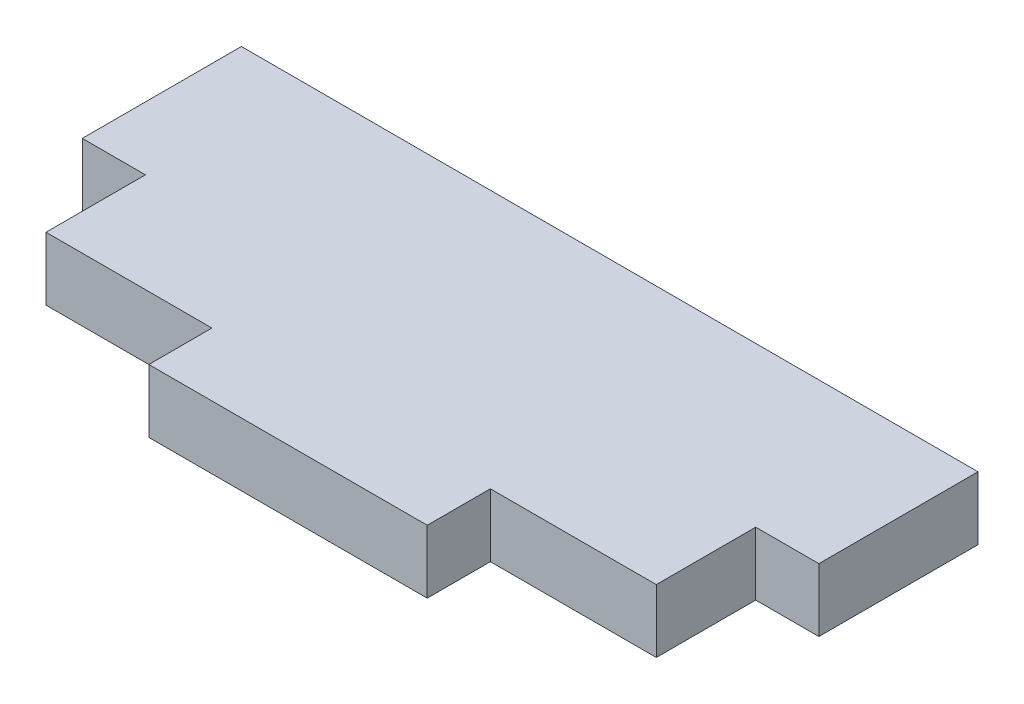
ISO-10303-21;
HEADER;
FILE_DESCRIPTION(('STEP AP214'),'2;1');
FILE_NAME('part.step','',(''),(''),'','','');
FILE_SCHEMA(('AUTOMOTIVE_DESIGN { 1 0 10303 214 1 1 1 1 }'));
ENDSEC;
DATA;
#1=APPLICATION_CONTEXT('core data for automotive mechanical design processes');
#2=APPLICATION_PROTOCOL_DEFINITION('international standard','automotive_design',2000,#1);
#3=PRODUCT_CONTEXT('',#1,'mechanical');
#4=PRODUCT('Part','Part','',(#3));
#5=PRODUCT_RELATED_PRODUCT_CATEGORY('part','',(#4));
#6=PRODUCT_DEFINITION_FORMATION('','',#4);
#7=PRODUCT_DEFINITION_CONTEXT('part definition',#1,'design');
#8=PRODUCT_DEFINITION('design','',#6,#7);
#9=PRODUCT_DEFINITION_SHAPE('','',#8);
#10=(LENGTH_UNIT() NAMED_UNIT(*) SI_UNIT(.MILLI.,.METRE.));
#11=(NAMED_UNIT(*) PLANE_ANGLE_UNIT() SI_UNIT($,.RADIAN.));
#12=(NAMED_UNIT(*) SI_UNIT($,.STERADIAN.) SOLID_ANGLE_UNIT());
#13=UNCERTAINTY_MEASURE_WITH_UNIT(LENGTH_MEASURE(1.E-05),#10,'distance_accuracy_value','');
#14=(GEOMETRIC_REPRESENTATION_CONTEXT(3) GLOBAL_UNCERTAINTY_ASSIGNED_CONTEXT((#13)) GLOBAL_UNIT_ASSIGNED_CONTEXT((#10,
#11,#12)) REPRESENTATION_CONTEXT('',''));
#15=CARTESIAN_POINT('',(0.,0.,0.));
#16=DIRECTION('',(0.,0.,1.));
#17=DIRECTION('',(1.,0.,0.));
#18=AXIS2_PLACEMENT_3D('',#15,#16,#17);
#19=CARTESIAN_POINT('',(0.,0.,0.));
#20=DIRECTION('',(0.,1.,0.));
#21=DIRECTION('',(0.,0.,1.));
#22=AXIS2_PLACEMENT_3D('',#19,#20,#21);
#23=PLANE('',#22);
#24=DIRECTION('',(0.,0.,1.));
#25=VECTOR('',#24,1.);
#26=CARTESIAN_POINT('',(-18.5173,0.,0.));
#27=LINE('',#26,#25);
#28=CARTESIAN_POINT('',(-18.5173,0.,1.865));
#29=VERTEX_POINT('',#28);
#30=CARTESIAN_POINT('',(-18.5173,0.,9.865));
#31=VERTEX_POINT('',#30);
#32=EDGE_CURVE('E209',#29,#31,#27,.T.);
#33=ORIENTED_EDGE('',*,*,#32,.F.);
#34=DIRECTION('',(1.,0.,0.));
#35=VECTOR('',#34,1.);
#36=CARTESIAN_POINT('',(0.,0.,1.865));
#37=LINE('',#36,#35);
#38=CARTESIAN_POINT('',(18.5173,0.,1.865));
#39=VERTEX_POINT('',#38);
#40=EDGE_CURVE('E244',#29,#39,#37,.T.);
#41=ORIENTED_EDGE('',*,*,#40,.T.);
#42=DIRECTION('',(0.,0.,1.));
#43=VECTOR('',#42,1.);
#44=CARTESIAN_POINT('',(18.5173,0.,0.));
#45=LINE('',#44,#43);
#46=CARTESIAN_POINT('',(18.5173,0.,9.865));
#47=VERTEX_POINT('',#46);
#48=EDGE_CURVE('E274',#39,#47,#45,.T.);
#49=ORIENTED_EDGE('',*,*,#48,.T.);
#50=DIRECTION('',(1.,0.,0.));
#51=VECTOR('',#50,1.);
#52=CARTESIAN_POINT('',(0.,0.,9.865));
#53=LINE('',#52,#51);
#54=CARTESIAN_POINT('',(15.3423,0.,9.865));
#55=VERTEX_POINT('',#54);
#56=EDGE_CURVE('E271',#55,#47,#53,.T.);
#57=ORIENTED_EDGE('',*,*,#56,.F.);
#58=DIRECTION('',(0.,0.,-1.));
#59=VECTOR('',#58,1.);
#60=CARTESIAN_POINT('',(15.3423,0.,0.));
#61=LINE('',#60,#59);
#62=CARTESIAN_POINT('',(15.3423,0.,14.865));
#63=VERTEX_POINT('',#62);
#64=EDGE_CURVE('E269',#63,#55,#61,.T.);
#65=ORIENTED_EDGE('',*,*,#64,.F.);
#66=DIRECTION('',(1.,0.,0.));
#67=VECTOR('',#66,1.);
#68=CARTESIAN_POINT('',(0.,0.,14.865));
#69=LINE('',#68,#67);
#70=CARTESIAN_POINT('',(7.,0.,14.865));
#71=VERTEX_POINT('',#70);
#72=EDGE_CURVE('E261',#71,#63,#69,.T.);
#73=ORIENTED_EDGE('',*,*,#72,.F.);
#74=DIRECTION('',(0.,0.,-1.));
#75=VECTOR('',#74,1.);
#76=CARTESIAN_POINT('',(7.,0.,18.04));
#77=LINE('',#76,#75);
#78=CARTESIAN_POINT('',(7.,0.,18.04));
#79=VERTEX_POINT('',#78);
#80=EDGE_CURVE('E230',#79,#71,#77,.T.);
#81=ORIENTED_EDGE('',*,*,#80,.F.);
#82=DIRECTION('',(1.,0.,0.));
#83=VECTOR('',#82,1.);
#84=CARTESIAN_POINT('',(0.,0.,18.04));
#85=LINE('',#84,#83);
#86=CARTESIAN_POINT('',(-7.,0.,18.04));
#87=VERTEX_POINT('',#86);
#88=EDGE_CURVE('E223',#87,#79,#85,.T.);
#89=ORIENTED_EDGE('',*,*,#88,.F.);
#90=DIRECTION('',(0.,0.,-1.));
#91=VECTOR('',#90,1.);
#92=CARTESIAN_POINT('',(-7.,0.,18.04));
#93=LINE('',#92,#91);
#94=CARTESIAN_POINT('',(-7.,0.,14.865));
#95=VERTEX_POINT('',#94);
#96=EDGE_CURVE('E233',#87,#95,#93,.T.);
#97=ORIENTED_EDGE('',*,*,#96,.T.);
#98=CARTESIAN_POINT('',(-15.3423,0.,14.865));
#99=VERTEX_POINT('',#98);
#100=EDGE_CURVE('E267',#99,#95,#69,.T.);
#101=ORIENTED_EDGE('',*,*,#100,.F.);
#102=DIRECTION('',(0.,0.,-1.));
#103=VECTOR('',#102,1.);
#104=CARTESIAN_POINT('',(-15.3423,0.,0.));
#105=LINE('',#104,#103);
#106=CARTESIAN_POINT('',(-15.3423,0.,9.865));
#107=VERTEX_POINT('',#106);
#108=EDGE_CURVE('E258',#99,#107,#105,.T.);
#109=ORIENTED_EDGE('',*,*,#108,.T.);
#110=DIRECTION('',(-1.,0.,0.));
#111=VECTOR('',#110,1.);
#112=CARTESIAN_POINT('',(0.,0.,9.865));
#113=LINE('',#112,#111);
#114=EDGE_CURVE('E262',#107,#31,#113,.T.);
#115=ORIENTED_EDGE('',*,*,#114,.T.);
#116=EDGE_LOOP('',(#33,#41,#49,#57,#65,#73,#81,#89,#97,#101,#109,#115));
#117=FACE_BOUND('',#116,.T.);
#118=ADVANCED_FACE('F111',(#117),#23,.F.);
#119=CARTESIAN_POINT('',(0.,3.175,0.));
#120=DIRECTION('',(0.,1.,0.));
#121=DIRECTION('',(0.,0.,1.));
#122=AXIS2_PLACEMENT_3D('',#119,#120,#121);
#123=PLANE('',#122);
#124=DIRECTION('',(0.,0.,1.));
#125=VECTOR('',#124,1.);
#126=CARTESIAN_POINT('',(18.5173,3.175,0.));
#127=LINE('',#126,#125);
#128=CARTESIAN_POINT('',(18.5173,3.175,1.865));
#129=VERTEX_POINT('',#128);
#130=CARTESIAN_POINT('',(18.5173,3.175,9.865));
#131=VERTEX_POINT('',#130);
#132=EDGE_CURVE('E254',#129,#131,#127,.T.);
#133=ORIENTED_EDGE('',*,*,#132,.F.);
#134=DIRECTION('',(-1.,0.,0.));
#135=VECTOR('',#134,1.);
#136=CARTESIAN_POINT('',(0.,3.175,1.865));
#137=LINE('',#136,#135);
#138=CARTESIAN_POINT('',(-18.5173,3.175,1.865));
#139=VERTEX_POINT('',#138);
#140=EDGE_CURVE('E241',#129,#139,#137,.T.);
#141=ORIENTED_EDGE('',*,*,#140,.T.);
#142=DIRECTION('',(0.,0.,1.));
#143=VECTOR('',#142,1.);
#144=CARTESIAN_POINT('',(-18.5173,3.175,0.));
#145=LINE('',#144,#143);
#146=CARTESIAN_POINT('',(-18.5173,3.175,9.865));
#147=VERTEX_POINT('',#146);
#148=EDGE_CURVE('E243',#139,#147,#145,.T.);
#149=ORIENTED_EDGE('',*,*,#148,.T.);
#150=DIRECTION('',(-1.,0.,0.));
#151=VECTOR('',#150,1.);
#152=CARTESIAN_POINT('',(0.,3.175,9.865));
#153=LINE('',#152,#151);
#154=CARTESIAN_POINT('',(-15.3423,3.175,9.865));
#155=VERTEX_POINT('',#154);
#156=EDGE_CURVE('E240',#155,#147,#153,.T.);
#157=ORIENTED_EDGE('',*,*,#156,.F.);
#158=DIRECTION('',(0.,0.,-1.));
#159=VECTOR('',#158,1.);
#160=CARTESIAN_POINT('',(-15.3423,3.175,0.));
#161=LINE('',#160,#159);
#162=CARTESIAN_POINT('',(-15.3423,3.175,14.865));
#163=VERTEX_POINT('',#162);
#164=EDGE_CURVE('E237',#163,#155,#161,.T.);
#165=ORIENTED_EDGE('',*,*,#164,.F.);
#166=DIRECTION('',(1.,0.,0.));
#167=VECTOR('',#166,1.);
#168=CARTESIAN_POINT('',(0.,3.175,14.865));
#169=LINE('',#168,#167);
#170=CARTESIAN_POINT('',(-7.,3.175,14.865));
#171=VERTEX_POINT('',#170);
#172=EDGE_CURVE('E248',#163,#171,#169,.T.);
#173=ORIENTED_EDGE('',*,*,#172,.T.);
#174=DIRECTION('',(0.,0.,-1.));
#175=VECTOR('',#174,1.);
#176=CARTESIAN_POINT('',(-7.,3.175,18.04));
#177=LINE('',#176,#175);
#178=CARTESIAN_POINT('',(-7.,3.175,18.04));
#179=VERTEX_POINT('',#178);
#180=EDGE_CURVE('E210',#179,#171,#177,.T.);
#181=ORIENTED_EDGE('',*,*,#180,.F.);
#182=DIRECTION('',(-1.,0.,0.));
#183=VECTOR('',#182,1.);
#184=CARTESIAN_POINT('',(0.,3.175,18.04));
#185=LINE('',#184,#183);
#186=CARTESIAN_POINT('',(7.,3.175,18.04));
#187=VERTEX_POINT('',#186);
#188=EDGE_CURVE('E213',#187,#179,#185,.T.);
#189=ORIENTED_EDGE('',*,*,#188,.F.);
#190=DIRECTION('',(0.,0.,-1.));
#191=VECTOR('',#190,1.);
#192=CARTESIAN_POINT('',(7.,3.175,18.04));
#193=LINE('',#192,#191);
#194=CARTESIAN_POINT('',(7.,3.175,14.865));
#195=VERTEX_POINT('',#194);
#196=EDGE_CURVE('E201',#187,#195,#193,.T.);
#197=ORIENTED_EDGE('',*,*,#196,.T.);
#198=CARTESIAN_POINT('',(15.3423,3.175,14.865));
#199=VERTEX_POINT('',#198);
#200=EDGE_CURVE('E126',#195,#199,#169,.T.);
#201=ORIENTED_EDGE('',*,*,#200,.T.);
#202=DIRECTION('',(0.,0.,-1.));
#203=VECTOR('',#202,1.);
#204=CARTESIAN_POINT('',(15.3423,3.175,0.));
#205=LINE('',#204,#203);
#206=CARTESIAN_POINT('',(15.3423,3.175,9.865));
#207=VERTEX_POINT('',#206);
#208=EDGE_CURVE('E250',#199,#207,#205,.T.);
#209=ORIENTED_EDGE('',*,*,#208,.T.);
#210=DIRECTION('',(1.,0.,0.));
#211=VECTOR('',#210,1.);
#212=CARTESIAN_POINT('',(0.,3.175,9.865));
#213=LINE('',#212,#211);
#214=EDGE_CURVE('E252',#207,#131,#213,.T.);
#215=ORIENTED_EDGE('',*,*,#214,.T.);
#216=EDGE_LOOP('',(#133,#141,#149,#157,#165,#173,#181,#189,#197,#201,#209,#215));
#217=FACE_BOUND('',#216,.T.);
#218=ADVANCED_FACE('F215',(#217),#123,.T.);
#219=CARTESIAN_POINT('',(0.,3.175,14.865));
#220=DIRECTION('',(0.,0.,-1.));
#221=DIRECTION('',(-1.,0.,0.));
#222=AXIS2_PLACEMENT_3D('',#219,#220,#221);
#223=PLANE('',#222);
#224=DIRECTION('',(0.,-1.,0.));
#225=VECTOR('',#224,1.);
#226=CARTESIAN_POINT('',(-7.,0.,14.865));
#227=LINE('',#226,#225);
#228=EDGE_CURVE('E134',#171,#95,#227,.T.);
#229=ORIENTED_EDGE('',*,*,#228,.F.);
#230=ORIENTED_EDGE('',*,*,#172,.F.);
#231=DIRECTION('',(0.,-1.,0.));
#232=VECTOR('',#231,1.);
#233=CARTESIAN_POINT('',(-15.3423,3.175,14.865));
#234=LINE('',#233,#232);
#235=EDGE_CURVE('E288',#163,#99,#234,.T.);
#236=ORIENTED_EDGE('',*,*,#235,.T.);
#237=ORIENTED_EDGE('',*,*,#100,.T.);
#238=EDGE_LOOP('',(#229,#230,#236,#237));
#239=FACE_BOUND('',#238,.T.);
#240=ADVANCED_FACE('F326',(#239),#223,.F.);
#241=CARTESIAN_POINT('',(0.,3.175,9.865));
#242=DIRECTION('',(0.,0.,1.));
#243=DIRECTION('',(1.,0.,0.));
#244=AXIS2_PLACEMENT_3D('',#241,#242,#243);
#245=PLANE('',#244);
#246=ORIENTED_EDGE('',*,*,#114,.F.);
#247=DIRECTION('',(0.,-1.,0.));
#248=VECTOR('',#247,1.);
#249=CARTESIAN_POINT('',(-15.3423,3.175,9.865));
#250=LINE('',#249,#248);
#251=EDGE_CURVE('E290',#155,#107,#250,.T.);
#252=ORIENTED_EDGE('',*,*,#251,.F.);
#253=ORIENTED_EDGE('',*,*,#156,.T.);
#254=DIRECTION('',(0.,-1.,0.));
#255=VECTOR('',#254,1.);
#256=CARTESIAN_POINT('',(-18.5173,3.175,9.865));
#257=LINE('',#256,#255);
#258=EDGE_CURVE('E119',#147,#31,#257,.T.);
#259=ORIENTED_EDGE('',*,*,#258,.T.);
#260=EDGE_LOOP('',(#246,#252,#253,#259));
#261=FACE_BOUND('',#260,.T.);
#262=ADVANCED_FACE('F294',(#261),#245,.T.);
#263=CARTESIAN_POINT('',(-18.5173,3.175,0.));
#264=DIRECTION('',(1.,0.,0.));
#265=DIRECTION('',(0.,0.,-1.));
#266=AXIS2_PLACEMENT_3D('',#263,#264,#265);
#267=PLANE('',#266);
#268=ORIENTED_EDGE('',*,*,#32,.T.);
#269=ORIENTED_EDGE('',*,*,#258,.F.);
#270=ORIENTED_EDGE('',*,*,#148,.F.);
#271=DIRECTION('',(0.,-1.,0.));
#272=VECTOR('',#271,1.);
#273=CARTESIAN_POINT('',(-18.5173,3.175,1.865));
#274=LINE('',#273,#272);
#275=EDGE_CURVE('E12',#139,#29,#274,.T.);
#276=ORIENTED_EDGE('',*,*,#275,.T.);
#277=EDGE_LOOP('',(#268,#269,#270,#276));
#278=FACE_BOUND('',#277,.T.);
#279=ADVANCED_FACE('F113',(#278),#267,.F.);
#280=ORIENTED_EDGE('',*,*,#200,.F.);
#281=DIRECTION('',(0.,-1.,0.));
#282=VECTOR('',#281,1.);
#283=CARTESIAN_POINT('',(7.,0.,14.865));
#284=LINE('',#283,#282);
#285=EDGE_CURVE('E207',#195,#71,#284,.T.);
#286=ORIENTED_EDGE('',*,*,#285,.T.);
#287=ORIENTED_EDGE('',*,*,#72,.T.);
#288=DIRECTION('',(0.,-1.,0.));
#289=VECTOR('',#288,1.);
#290=CARTESIAN_POINT('',(15.3423,3.175,14.865));
#291=LINE('',#290,#289);
#292=EDGE_CURVE('E285',#199,#63,#291,.T.);
#293=ORIENTED_EDGE('',*,*,#292,.F.);
#294=EDGE_LOOP('',(#280,#286,#287,#293));
#295=FACE_BOUND('',#294,.T.);
#296=ADVANCED_FACE('F323',(#295),#223,.F.);
#297=CARTESIAN_POINT('',(15.3423,3.175,0.));
#298=DIRECTION('',(-1.,0.,0.));
#299=DIRECTION('',(0.,0.,1.));
#300=AXIS2_PLACEMENT_3D('',#297,#298,#299);
#301=PLANE('',#300);
#302=ORIENTED_EDGE('',*,*,#64,.T.);
#303=DIRECTION('',(0.,-1.,0.));
#304=VECTOR('',#303,1.);
#305=CARTESIAN_POINT('',(15.3423,3.175,9.865));
#306=LINE('',#305,#304);
#307=EDGE_CURVE('E282',#207,#55,#306,.T.);
#308=ORIENTED_EDGE('',*,*,#307,.F.);
#309=ORIENTED_EDGE('',*,*,#208,.F.);
#310=ORIENTED_EDGE('',*,*,#292,.T.);
#311=EDGE_LOOP('',(#302,#308,#309,#310));
#312=FACE_BOUND('',#311,.T.);
#313=ADVANCED_FACE('F321',(#312),#301,.F.);
#314=CARTESIAN_POINT('',(0.,3.175,9.865));
#315=DIRECTION('',(0.,0.,-1.));
#316=DIRECTION('',(-1.,0.,0.));
#317=AXIS2_PLACEMENT_3D('',#314,#315,#316);
#318=PLANE('',#317);
#319=ORIENTED_EDGE('',*,*,#56,.T.);
#320=DIRECTION('',(0.,-1.,0.));
#321=VECTOR('',#320,1.);
#322=CARTESIAN_POINT('',(18.5173,3.175,9.865));
#323=LINE('',#322,#321);
#324=EDGE_CURVE('E280',#131,#47,#323,.T.);
#325=ORIENTED_EDGE('',*,*,#324,.F.);
#326=ORIENTED_EDGE('',*,*,#214,.F.);
#327=ORIENTED_EDGE('',*,*,#307,.T.);
#328=EDGE_LOOP('',(#319,#325,#326,#327));
#329=FACE_BOUND('',#328,.T.);
#330=ADVANCED_FACE('F317',(#329),#318,.F.);
#331=CARTESIAN_POINT('',(18.5173,3.175,0.));
#332=DIRECTION('',(1.,0.,0.));
#333=DIRECTION('',(0.,0.,-1.));
#334=AXIS2_PLACEMENT_3D('',#331,#332,#333);
#335=PLANE('',#334);
#336=ORIENTED_EDGE('',*,*,#48,.F.);
#337=DIRECTION('',(0.,-1.,0.));
#338=VECTOR('',#337,1.);
#339=CARTESIAN_POINT('',(18.5173,3.175,1.865));
#340=LINE('',#339,#338);
#341=EDGE_CURVE('E257',#129,#39,#340,.T.);
#342=ORIENTED_EDGE('',*,*,#341,.F.);
#343=ORIENTED_EDGE('',*,*,#132,.T.);
#344=ORIENTED_EDGE('',*,*,#324,.T.);
#345=EDGE_LOOP('',(#336,#342,#343,#344));
#346=FACE_BOUND('',#345,.T.);
#347=ADVANCED_FACE('F313',(#346),#335,.T.);
#348=CARTESIAN_POINT('',(0.,3.175,1.865));
#349=DIRECTION('',(0.,0.,-1.));
#350=DIRECTION('',(-1.,0.,0.));
#351=AXIS2_PLACEMENT_3D('',#348,#349,#350);
#352=PLANE('',#351);
#353=ORIENTED_EDGE('',*,*,#40,.F.);
#354=ORIENTED_EDGE('',*,*,#275,.F.);
#355=ORIENTED_EDGE('',*,*,#140,.F.);
#356=ORIENTED_EDGE('',*,*,#341,.T.);
#357=EDGE_LOOP('',(#353,#354,#355,#356));
#358=FACE_BOUND('',#357,.T.);
#359=ADVANCED_FACE('F308',(#358),#352,.T.);
#360=CARTESIAN_POINT('',(-15.3423,3.175,0.));
#361=DIRECTION('',(-1.,0.,0.));
#362=DIRECTION('',(0.,0.,1.));
#363=AXIS2_PLACEMENT_3D('',#360,#361,#362);
#364=PLANE('',#363);
#365=ORIENTED_EDGE('',*,*,#108,.F.);
#366=ORIENTED_EDGE('',*,*,#235,.F.);
#367=ORIENTED_EDGE('',*,*,#164,.T.);
#368=ORIENTED_EDGE('',*,*,#251,.T.);
#369=EDGE_LOOP('',(#365,#366,#367,#368));
#370=FACE_BOUND('',#369,.T.);
#371=ADVANCED_FACE('F304',(#370),#364,.T.);
#372=CARTESIAN_POINT('',(7.,0.,18.04));
#373=DIRECTION('',(1.,0.,0.));
#374=DIRECTION('',(0.,0.,-1.));
#375=AXIS2_PLACEMENT_3D('',#372,#373,#374);
#376=PLANE('',#375);
#377=ORIENTED_EDGE('',*,*,#285,.F.);
#378=ORIENTED_EDGE('',*,*,#196,.F.);
#379=DIRECTION('',(0.,-1.,0.));
#380=VECTOR('',#379,1.);
#381=CARTESIAN_POINT('',(7.,0.,18.04));
#382=LINE('',#381,#380);
#383=EDGE_CURVE('E206',#187,#79,#382,.T.);
#384=ORIENTED_EDGE('',*,*,#383,.T.);
#385=ORIENTED_EDGE('',*,*,#80,.T.);
#386=EDGE_LOOP('',(#377,#378,#384,#385));
#387=FACE_BOUND('',#386,.T.);
#388=ADVANCED_FACE('F203',(#387),#376,.T.);
#389=CARTESIAN_POINT('',(-7.,0.,18.04));
#390=DIRECTION('',(1.,0.,0.));
#391=DIRECTION('',(0.,1.,0.));
#392=AXIS2_PLACEMENT_3D('',#389,#390,#391);
#393=PLANE('',#392);
#394=ORIENTED_EDGE('',*,*,#228,.T.);
#395=ORIENTED_EDGE('',*,*,#96,.F.);
#396=DIRECTION('',(0.,-1.,0.));
#397=VECTOR('',#396,1.);
#398=CARTESIAN_POINT('',(-7.,0.,18.04));
#399=LINE('',#398,#397);
#400=EDGE_CURVE('E219',#179,#87,#399,.T.);
#401=ORIENTED_EDGE('',*,*,#400,.F.);
#402=ORIENTED_EDGE('',*,*,#180,.T.);
#403=EDGE_LOOP('',(#394,#395,#401,#402));
#404=FACE_BOUND('',#403,.T.);
#405=ADVANCED_FACE('F372',(#404),#393,.F.);
#406=CARTESIAN_POINT('',(0.,0.,18.04));
#407=DIRECTION('',(0.,0.,1.));
#408=DIRECTION('',(1.,0.,0.));
#409=AXIS2_PLACEMENT_3D('',#406,#407,#408);
#410=PLANE('',#409);
#411=ORIENTED_EDGE('',*,*,#383,.F.);
#412=ORIENTED_EDGE('',*,*,#188,.T.);
#413=ORIENTED_EDGE('',*,*,#400,.T.);
#414=ORIENTED_EDGE('',*,*,#88,.T.);
#415=EDGE_LOOP('',(#411,#412,#413,#414));
#416=FACE_BOUND('',#415,.T.);
#417=ADVANCED_FACE('F221',(#416),#410,.T.);
#418=CLOSED_SHELL('',(#118,#218,#240,#262,#279,#296,#313,#330,#347,#359,#371,#388,#405,#417));
#419=MANIFOLD_SOLID_BREP('B2',#418);
#420=ADVANCED_BREP_SHAPE_REPRESENTATION('',(#18,#419),#14);
#421=SHAPE_DEFINITION_REPRESENTATION(#9,#420);
ENDSEC;
END-ISO-10303-21;
